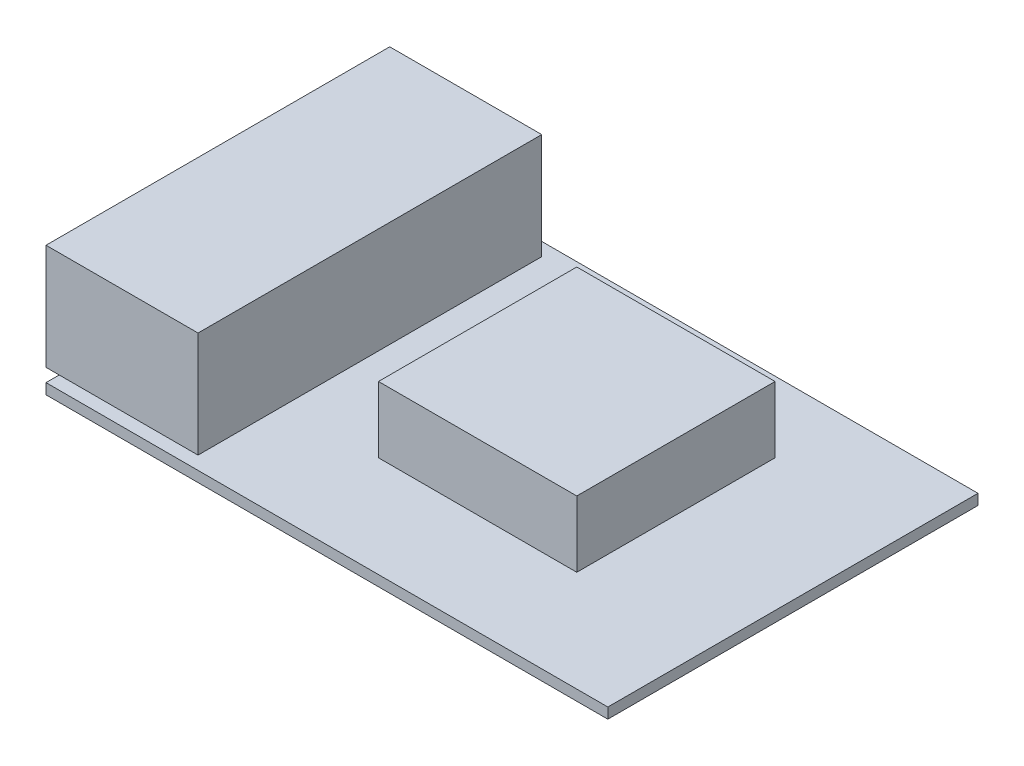
ISO-10303-21;
HEADER;
FILE_DESCRIPTION(('STEP AP214'),'2;1');
FILE_NAME('part.step','',(''),(''),'','','');
FILE_SCHEMA(('AUTOMOTIVE_DESIGN { 1 0 10303 214 1 1 1 1 }'));
ENDSEC;
DATA;
#1=APPLICATION_CONTEXT('core data for automotive mechanical design processes');
#2=APPLICATION_PROTOCOL_DEFINITION('international standard','automotive_design',2000,#1);
#3=PRODUCT_CONTEXT('',#1,'mechanical');
#4=PRODUCT('Part','Part','',(#3));
#5=PRODUCT_RELATED_PRODUCT_CATEGORY('part','',(#4));
#6=PRODUCT_DEFINITION_FORMATION('','',#4);
#7=PRODUCT_DEFINITION_CONTEXT('part definition',#1,'design');
#8=PRODUCT_DEFINITION('design','',#6,#7);
#9=PRODUCT_DEFINITION_SHAPE('','',#8);
#10=(LENGTH_UNIT() NAMED_UNIT(*) SI_UNIT(.MILLI.,.METRE.));
#11=(NAMED_UNIT(*) PLANE_ANGLE_UNIT() SI_UNIT($,.RADIAN.));
#12=(NAMED_UNIT(*) SI_UNIT($,.STERADIAN.) SOLID_ANGLE_UNIT());
#13=UNCERTAINTY_MEASURE_WITH_UNIT(LENGTH_MEASURE(1.E-05),#10,'distance_accuracy_value','');
#14=(GEOMETRIC_REPRESENTATION_CONTEXT(3) GLOBAL_UNCERTAINTY_ASSIGNED_CONTEXT((#13)) GLOBAL_UNIT_ASSIGNED_CONTEXT((#10,
#11,#12)) REPRESENTATION_CONTEXT('',''));
#15=CARTESIAN_POINT('',(0.,0.,0.));
#16=DIRECTION('',(0.,0.,1.));
#17=DIRECTION('',(1.,0.,0.));
#18=AXIS2_PLACEMENT_3D('',#15,#16,#17);
#19=CARTESIAN_POINT('',(1.,-0.400000000000001,43.));
#20=DIRECTION('',(1.,0.,0.));
#21=DIRECTION('',(0.,0.,-1.));
#22=AXIS2_PLACEMENT_3D('',#19,#20,#21);
#23=PLANE('',#22);
#24=DIRECTION('',(0.,0.,1.));
#25=VECTOR('',#24,1.);
#26=CARTESIAN_POINT('',(1.,-10.4,43.));
#27=LINE('',#26,#25);
#28=CARTESIAN_POINT('',(1.,-10.4,43.));
#29=VERTEX_POINT('',#28);
#30=CARTESIAN_POINT('',(1.,-10.4,73.));
#31=VERTEX_POINT('',#30);
#32=EDGE_CURVE('E112',#29,#31,#27,.T.);
#33=ORIENTED_EDGE('',*,*,#32,.T.);
#34=DIRECTION('',(0.,-1.,0.));
#35=VECTOR('',#34,1.);
#36=CARTESIAN_POINT('',(1.,-0.400000000000001,73.));
#37=LINE('',#36,#35);
#38=CARTESIAN_POINT('',(1.,-0.400000000000001,73.));
#39=VERTEX_POINT('',#38);
#40=EDGE_CURVE('E12',#39,#31,#37,.T.);
#41=ORIENTED_EDGE('',*,*,#40,.F.);
#42=DIRECTION('',(0.,0.,1.));
#43=VECTOR('',#42,1.);
#44=CARTESIAN_POINT('',(1.,-0.400000000000001,43.));
#45=LINE('',#44,#43);
#46=CARTESIAN_POINT('',(1.,-0.400000000000001,43.));
#47=VERTEX_POINT('',#46);
#48=EDGE_CURVE('E100',#47,#39,#45,.T.);
#49=ORIENTED_EDGE('',*,*,#48,.F.);
#50=DIRECTION('',(0.,-1.,0.));
#51=VECTOR('',#50,1.);
#52=CARTESIAN_POINT('',(1.,-0.400000000000001,43.));
#53=LINE('',#52,#51);
#54=EDGE_CURVE('E108',#47,#29,#53,.T.);
#55=ORIENTED_EDGE('',*,*,#54,.T.);
#56=EDGE_LOOP('',(#33,#41,#49,#55));
#57=FACE_BOUND('',#56,.T.);
#58=ADVANCED_FACE('F49',(#57),#23,.F.);
#59=CARTESIAN_POINT('',(1.,-0.400000000000001,73.));
#60=DIRECTION('',(0.,0.,-1.));
#61=DIRECTION('',(-1.,0.,0.));
#62=AXIS2_PLACEMENT_3D('',#59,#60,#61);
#63=PLANE('',#62);
#64=DIRECTION('',(1.,0.,0.));
#65=VECTOR('',#64,1.);
#66=CARTESIAN_POINT('',(1.,-10.4,73.));
#67=LINE('',#66,#65);
#68=CARTESIAN_POINT('',(31.,-10.4,73.));
#69=VERTEX_POINT('',#68);
#70=EDGE_CURVE('E104',#31,#69,#67,.T.);
#71=ORIENTED_EDGE('',*,*,#70,.T.);
#72=DIRECTION('',(0.,-1.,0.));
#73=VECTOR('',#72,1.);
#74=CARTESIAN_POINT('',(31.,-0.400000000000001,73.));
#75=LINE('',#74,#73);
#76=CARTESIAN_POINT('',(31.,-0.400000000000001,73.));
#77=VERTEX_POINT('',#76);
#78=EDGE_CURVE('E57',#77,#69,#75,.T.);
#79=ORIENTED_EDGE('',*,*,#78,.F.);
#80=DIRECTION('',(1.,0.,0.));
#81=VECTOR('',#80,1.);
#82=CARTESIAN_POINT('',(1.,-0.400000000000001,73.));
#83=LINE('',#82,#81);
#84=EDGE_CURVE('E95',#39,#77,#83,.T.);
#85=ORIENTED_EDGE('',*,*,#84,.F.);
#86=ORIENTED_EDGE('',*,*,#40,.T.);
#87=EDGE_LOOP('',(#71,#79,#85,#86));
#88=FACE_BOUND('',#87,.T.);
#89=ADVANCED_FACE('F103',(#88),#63,.F.);
#90=CARTESIAN_POINT('',(31.,-0.400000000000001,73.));
#91=DIRECTION('',(-1.,0.,0.));
#92=DIRECTION('',(0.,0.,1.));
#93=AXIS2_PLACEMENT_3D('',#90,#91,#92);
#94=PLANE('',#93);
#95=DIRECTION('',(0.,0.,-1.));
#96=VECTOR('',#95,1.);
#97=CARTESIAN_POINT('',(31.,-10.4,73.));
#98=LINE('',#97,#96);
#99=CARTESIAN_POINT('',(31.,-10.4,43.));
#100=VERTEX_POINT('',#99);
#101=EDGE_CURVE('E82',#69,#100,#98,.T.);
#102=ORIENTED_EDGE('',*,*,#101,.T.);
#103=DIRECTION('',(0.,-1.,0.));
#104=VECTOR('',#103,1.);
#105=CARTESIAN_POINT('',(31.,-0.400000000000001,43.));
#106=LINE('',#105,#104);
#107=CARTESIAN_POINT('',(31.,-0.400000000000001,43.));
#108=VERTEX_POINT('',#107);
#109=EDGE_CURVE('E105',#108,#100,#106,.T.);
#110=ORIENTED_EDGE('',*,*,#109,.F.);
#111=DIRECTION('',(0.,0.,-1.));
#112=VECTOR('',#111,1.);
#113=CARTESIAN_POINT('',(31.,-0.400000000000001,73.));
#114=LINE('',#113,#112);
#115=EDGE_CURVE('E98',#77,#108,#114,.T.);
#116=ORIENTED_EDGE('',*,*,#115,.F.);
#117=ORIENTED_EDGE('',*,*,#78,.T.);
#118=EDGE_LOOP('',(#102,#110,#116,#117));
#119=FACE_BOUND('',#118,.T.);
#120=ADVANCED_FACE('F106',(#119),#94,.F.);
#121=CARTESIAN_POINT('',(31.,-0.400000000000001,43.));
#122=DIRECTION('',(0.,0.,1.));
#123=DIRECTION('',(1.,0.,0.));
#124=AXIS2_PLACEMENT_3D('',#121,#122,#123);
#125=PLANE('',#124);
#126=DIRECTION('',(-1.,0.,0.));
#127=VECTOR('',#126,1.);
#128=CARTESIAN_POINT('',(31.,-10.4,43.));
#129=LINE('',#128,#127);
#130=EDGE_CURVE('E88',#100,#29,#129,.T.);
#131=ORIENTED_EDGE('',*,*,#130,.T.);
#132=ORIENTED_EDGE('',*,*,#54,.F.);
#133=DIRECTION('',(-1.,0.,0.));
#134=VECTOR('',#133,1.);
#135=CARTESIAN_POINT('',(31.,-0.400000000000001,43.));
#136=LINE('',#135,#134);
#137=EDGE_CURVE('E65',#108,#47,#136,.T.);
#138=ORIENTED_EDGE('',*,*,#137,.F.);
#139=ORIENTED_EDGE('',*,*,#109,.T.);
#140=EDGE_LOOP('',(#131,#132,#138,#139));
#141=FACE_BOUND('',#140,.T.);
#142=ADVANCED_FACE('F119',(#141),#125,.F.);
#143=CARTESIAN_POINT('',(0.,-0.400000000000001,0.));
#144=DIRECTION('',(0.,1.,0.));
#145=DIRECTION('',(0.,0.,1.));
#146=AXIS2_PLACEMENT_3D('',#143,#144,#145);
#147=PLANE('',#146);
#148=ORIENTED_EDGE('',*,*,#48,.T.);
#149=ORIENTED_EDGE('',*,*,#84,.T.);
#150=ORIENTED_EDGE('',*,*,#115,.T.);
#151=ORIENTED_EDGE('',*,*,#137,.T.);
#152=EDGE_LOOP('',(#148,#149,#150,#151));
#153=FACE_BOUND('',#152,.T.);
#154=ADVANCED_FACE('F96',(#153),#147,.T.);
#155=CARTESIAN_POINT('',(0.,-10.4,0.));
#156=DIRECTION('',(0.,1.,0.));
#157=DIRECTION('',(0.,0.,1.));
#158=AXIS2_PLACEMENT_3D('',#155,#156,#157);
#159=PLANE('',#158);
#160=ORIENTED_EDGE('',*,*,#32,.F.);
#161=ORIENTED_EDGE('',*,*,#130,.F.);
#162=ORIENTED_EDGE('',*,*,#101,.F.);
#163=ORIENTED_EDGE('',*,*,#70,.F.);
#164=EDGE_LOOP('',(#160,#161,#162,#163));
#165=FACE_BOUND('',#164,.T.);
#166=ADVANCED_FACE('F122',(#165),#159,.F.);
#167=CLOSED_SHELL('',(#58,#89,#120,#142,#154,#166));
#168=MANIFOLD_SOLID_BREP('B2',#167);
#169=CARTESIAN_POINT('',(-40.,-16.4,26.3));
#170=DIRECTION('',(1.,0.,0.));
#171=DIRECTION('',(0.,0.,-1.));
#172=AXIS2_PLACEMENT_3D('',#169,#170,#171);
#173=PLANE('',#172);
#174=DIRECTION('',(0.,0.,1.));
#175=VECTOR('',#174,1.);
#176=CARTESIAN_POINT('',(-40.,-18.,26.3));
#177=LINE('',#176,#175);
#178=CARTESIAN_POINT('',(-40.,-18.,26.3));
#179=VERTEX_POINT('',#178);
#180=CARTESIAN_POINT('',(-40.,-18.,82.3));
#181=VERTEX_POINT('',#180);
#182=EDGE_CURVE('E268',#179,#181,#177,.T.);
#183=ORIENTED_EDGE('',*,*,#182,.T.);
#184=DIRECTION('',(0.,-1.,0.));
#185=VECTOR('',#184,1.);
#186=CARTESIAN_POINT('',(-40.,-16.4,82.3));
#187=LINE('',#186,#185);
#188=CARTESIAN_POINT('',(-40.,-16.4,82.3));
#189=VERTEX_POINT('',#188);
#190=EDGE_CURVE('E176',#189,#181,#187,.T.);
#191=ORIENTED_EDGE('',*,*,#190,.F.);
#192=DIRECTION('',(0.,0.,1.));
#193=VECTOR('',#192,1.);
#194=CARTESIAN_POINT('',(-40.,-16.4,26.3));
#195=LINE('',#194,#193);
#196=CARTESIAN_POINT('',(-40.,-16.4,80.3));
#197=VERTEX_POINT('',#196);
#198=EDGE_CURVE('E281',#197,#189,#195,.T.);
#199=ORIENTED_EDGE('',*,*,#198,.F.);
#200=CARTESIAN_POINT('',(-40.,-16.4,28.3));
#201=VERTEX_POINT('',#200);
#202=EDGE_CURVE('E280',#201,#197,#195,.T.);
#203=ORIENTED_EDGE('',*,*,#202,.F.);
#204=CARTESIAN_POINT('',(-40.,-16.4,26.3));
#205=VERTEX_POINT('',#204);
#206=EDGE_CURVE('E277',#205,#201,#195,.T.);
#207=ORIENTED_EDGE('',*,*,#206,.F.);
#208=DIRECTION('',(0.,-1.,0.));
#209=VECTOR('',#208,1.);
#210=CARTESIAN_POINT('',(-40.,-16.4,26.3));
#211=LINE('',#210,#209);
#212=EDGE_CURVE('E286',#205,#179,#211,.T.);
#213=ORIENTED_EDGE('',*,*,#212,.T.);
#214=EDGE_LOOP('',(#183,#191,#199,#203,#207,#213));
#215=FACE_BOUND('',#214,.T.);
#216=ADVANCED_FACE('F173',(#215),#173,.F.);
#217=CARTESIAN_POINT('',(-40.,-16.4,82.3));
#218=DIRECTION('',(0.,0.,-1.));
#219=DIRECTION('',(-1.,0.,0.));
#220=AXIS2_PLACEMENT_3D('',#217,#218,#219);
#221=PLANE('',#220);
#222=DIRECTION('',(1.,0.,0.));
#223=VECTOR('',#222,1.);
#224=CARTESIAN_POINT('',(-40.,-18.,82.3));
#225=LINE('',#224,#223);
#226=CARTESIAN_POINT('',(45.,-18.,82.3));
#227=VERTEX_POINT('',#226);
#228=EDGE_CURVE('E271',#181,#227,#225,.T.);
#229=ORIENTED_EDGE('',*,*,#228,.T.);
#230=DIRECTION('',(0.,-1.,0.));
#231=VECTOR('',#230,1.);
#232=CARTESIAN_POINT('',(45.,-16.4,82.3));
#233=LINE('',#232,#231);
#234=CARTESIAN_POINT('',(45.,-16.4,82.3));
#235=VERTEX_POINT('',#234);
#236=EDGE_CURVE('E297',#235,#227,#233,.T.);
#237=ORIENTED_EDGE('',*,*,#236,.F.);
#238=DIRECTION('',(1.,0.,0.));
#239=VECTOR('',#238,1.);
#240=CARTESIAN_POINT('',(-40.,-16.4,82.3));
#241=LINE('',#240,#239);
#242=EDGE_CURVE('E279',#189,#235,#241,.T.);
#243=ORIENTED_EDGE('',*,*,#242,.F.);
#244=ORIENTED_EDGE('',*,*,#190,.T.);
#245=EDGE_LOOP('',(#229,#237,#243,#244));
#246=FACE_BOUND('',#245,.T.);
#247=ADVANCED_FACE('F307',(#246),#221,.F.);
#248=CARTESIAN_POINT('',(45.,-16.4,82.3));
#249=DIRECTION('',(-1.,0.,0.));
#250=DIRECTION('',(0.,0.,1.));
#251=AXIS2_PLACEMENT_3D('',#248,#249,#250);
#252=PLANE('',#251);
#253=DIRECTION('',(0.,0.,-1.));
#254=VECTOR('',#253,1.);
#255=CARTESIAN_POINT('',(45.,-18.,82.3));
#256=LINE('',#255,#254);
#257=CARTESIAN_POINT('',(45.,-18.,26.3));
#258=VERTEX_POINT('',#257);
#259=EDGE_CURVE('E289',#227,#258,#256,.T.);
#260=ORIENTED_EDGE('',*,*,#259,.T.);
#261=DIRECTION('',(0.,-1.,0.));
#262=VECTOR('',#261,1.);
#263=CARTESIAN_POINT('',(45.,-16.4,26.3));
#264=LINE('',#263,#262);
#265=CARTESIAN_POINT('',(45.,-16.4,26.3));
#266=VERTEX_POINT('',#265);
#267=EDGE_CURVE('E295',#266,#258,#264,.T.);
#268=ORIENTED_EDGE('',*,*,#267,.F.);
#269=DIRECTION('',(0.,0.,-1.));
#270=VECTOR('',#269,1.);
#271=CARTESIAN_POINT('',(45.,-16.4,82.3));
#272=LINE('',#271,#270);
#273=EDGE_CURVE('E283',#235,#266,#272,.T.);
#274=ORIENTED_EDGE('',*,*,#273,.F.);
#275=ORIENTED_EDGE('',*,*,#236,.T.);
#276=EDGE_LOOP('',(#260,#268,#274,#275));
#277=FACE_BOUND('',#276,.T.);
#278=ADVANCED_FACE('F316',(#277),#252,.F.);
#279=CARTESIAN_POINT('',(45.,-16.4,26.3));
#280=DIRECTION('',(0.,0.,1.));
#281=DIRECTION('',(1.,0.,0.));
#282=AXIS2_PLACEMENT_3D('',#279,#280,#281);
#283=PLANE('',#282);
#284=DIRECTION('',(-1.,0.,0.));
#285=VECTOR('',#284,1.);
#286=CARTESIAN_POINT('',(45.,-18.,26.3));
#287=LINE('',#286,#285);
#288=EDGE_CURVE('E291',#258,#179,#287,.T.);
#289=ORIENTED_EDGE('',*,*,#288,.T.);
#290=ORIENTED_EDGE('',*,*,#212,.F.);
#291=DIRECTION('',(-1.,0.,0.));
#292=VECTOR('',#291,1.);
#293=CARTESIAN_POINT('',(45.,-16.4,26.3));
#294=LINE('',#293,#292);
#295=EDGE_CURVE('E285',#266,#205,#294,.T.);
#296=ORIENTED_EDGE('',*,*,#295,.F.);
#297=ORIENTED_EDGE('',*,*,#267,.T.);
#298=EDGE_LOOP('',(#289,#290,#296,#297));
#299=FACE_BOUND('',#298,.T.);
#300=ADVANCED_FACE('F319',(#299),#283,.F.);
#301=CARTESIAN_POINT('',(0.,-16.4,0.));
#302=DIRECTION('',(0.,1.,0.));
#303=DIRECTION('',(0.,0.,1.));
#304=AXIS2_PLACEMENT_3D('',#301,#302,#303);
#305=PLANE('',#304);
#306=DIRECTION('',(-1.,0.,0.));
#307=VECTOR('',#306,1.);
#308=CARTESIAN_POINT('',(-19.,-16.4,28.3));
#309=LINE('',#308,#307);
#310=CARTESIAN_POINT('',(-19.,-16.4,28.3));
#311=VERTEX_POINT('',#310);
#312=EDGE_CURVE('E189',#311,#201,#309,.T.);
#313=ORIENTED_EDGE('',*,*,#312,.F.);
#314=DIRECTION('',(0.,0.,-1.));
#315=VECTOR('',#314,1.);
#316=CARTESIAN_POINT('',(-19.,-16.4,80.3));
#317=LINE('',#316,#315);
#318=CARTESIAN_POINT('',(-19.,-16.4,80.3));
#319=VERTEX_POINT('',#318);
#320=EDGE_CURVE('E326',#319,#311,#317,.T.);
#321=ORIENTED_EDGE('',*,*,#320,.F.);
#322=DIRECTION('',(1.,0.,0.));
#323=VECTOR('',#322,1.);
#324=CARTESIAN_POINT('',(-42.,-16.4,80.3));
#325=LINE('',#324,#323);
#326=EDGE_CURVE('E47',#197,#319,#325,.T.);
#327=ORIENTED_EDGE('',*,*,#326,.F.);
#328=ORIENTED_EDGE('',*,*,#198,.T.);
#329=ORIENTED_EDGE('',*,*,#242,.T.);
#330=ORIENTED_EDGE('',*,*,#273,.T.);
#331=ORIENTED_EDGE('',*,*,#295,.T.);
#332=ORIENTED_EDGE('',*,*,#206,.T.);
#333=EDGE_LOOP('',(#313,#321,#327,#328,#329,#330,#331,#332));
#334=FACE_BOUND('',#333,.T.);
#335=ADVANCED_FACE('F320',(#334),#305,.T.);
#336=CARTESIAN_POINT('',(0.,-18.,0.));
#337=DIRECTION('',(0.,1.,0.));
#338=DIRECTION('',(0.,0.,1.));
#339=AXIS2_PLACEMENT_3D('',#336,#337,#338);
#340=PLANE('',#339);
#341=ORIENTED_EDGE('',*,*,#182,.F.);
#342=ORIENTED_EDGE('',*,*,#288,.F.);
#343=ORIENTED_EDGE('',*,*,#259,.F.);
#344=ORIENTED_EDGE('',*,*,#228,.F.);
#345=EDGE_LOOP('',(#341,#342,#343,#344));
#346=FACE_BOUND('',#345,.T.);
#347=ADVANCED_FACE('F314',(#346),#340,.F.);
#348=CARTESIAN_POINT('',(0.,-16.4,0.));
#349=DIRECTION('',(0.,1.,0.));
#350=DIRECTION('',(0.,0.,1.));
#351=AXIS2_PLACEMENT_3D('',#348,#349,#350);
#352=PLANE('',#351);
#353=CARTESIAN_POINT('',(-42.,-16.4,28.3));
#354=VERTEX_POINT('',#353);
#355=EDGE_CURVE('E325',#201,#354,#309,.T.);
#356=ORIENTED_EDGE('',*,*,#355,.F.);
#357=ORIENTED_EDGE('',*,*,#202,.T.);
#358=CARTESIAN_POINT('',(-42.,-16.4,80.3));
#359=VERTEX_POINT('',#358);
#360=EDGE_CURVE('E182',#359,#197,#325,.T.);
#361=ORIENTED_EDGE('',*,*,#360,.F.);
#362=DIRECTION('',(0.,0.,1.));
#363=VECTOR('',#362,1.);
#364=CARTESIAN_POINT('',(-42.,-16.4,28.3));
#365=LINE('',#364,#363);
#366=EDGE_CURVE('E267',#354,#359,#365,.T.);
#367=ORIENTED_EDGE('',*,*,#366,.F.);
#368=EDGE_LOOP('',(#356,#357,#361,#367));
#369=FACE_BOUND('',#368,.T.);
#370=ADVANCED_FACE('F324',(#369),#352,.F.);
#371=CARTESIAN_POINT('',(-42.,-0.399999999999998,28.3));
#372=DIRECTION('',(1.,0.,0.));
#373=DIRECTION('',(0.,0.,-1.));
#374=AXIS2_PLACEMENT_3D('',#371,#372,#373);
#375=PLANE('',#374);
#376=ORIENTED_EDGE('',*,*,#366,.T.);
#377=DIRECTION('',(0.,-1.,0.));
#378=VECTOR('',#377,1.);
#379=CARTESIAN_POINT('',(-42.,-0.399999999999998,80.3));
#380=LINE('',#379,#378);
#381=CARTESIAN_POINT('',(-42.,-0.399999999999998,80.3));
#382=VERTEX_POINT('',#381);
#383=EDGE_CURVE('E248',#382,#359,#380,.T.);
#384=ORIENTED_EDGE('',*,*,#383,.F.);
#385=DIRECTION('',(0.,0.,1.));
#386=VECTOR('',#385,1.);
#387=CARTESIAN_POINT('',(-42.,-0.399999999999998,28.3));
#388=LINE('',#387,#386);
#389=CARTESIAN_POINT('',(-42.,-0.399999999999998,28.3));
#390=VERTEX_POINT('',#389);
#391=EDGE_CURVE('E255',#390,#382,#388,.T.);
#392=ORIENTED_EDGE('',*,*,#391,.F.);
#393=DIRECTION('',(0.,-1.,0.));
#394=VECTOR('',#393,1.);
#395=CARTESIAN_POINT('',(-42.,-0.399999999999998,28.3));
#396=LINE('',#395,#394);
#397=EDGE_CURVE('E332',#390,#354,#396,.T.);
#398=ORIENTED_EDGE('',*,*,#397,.T.);
#399=EDGE_LOOP('',(#376,#384,#392,#398));
#400=FACE_BOUND('',#399,.T.);
#401=ADVANCED_FACE('F265',(#400),#375,.F.);
#402=CARTESIAN_POINT('',(-42.,-0.399999999999998,80.3));
#403=DIRECTION('',(0.,0.,-1.));
#404=DIRECTION('',(-1.,0.,0.));
#405=AXIS2_PLACEMENT_3D('',#402,#403,#404);
#406=PLANE('',#405);
#407=ORIENTED_EDGE('',*,*,#360,.T.);
#408=ORIENTED_EDGE('',*,*,#326,.T.);
#409=DIRECTION('',(0.,-1.,0.));
#410=VECTOR('',#409,1.);
#411=CARTESIAN_POINT('',(-19.,-0.399999999999998,80.3));
#412=LINE('',#411,#410);
#413=CARTESIAN_POINT('',(-19.,-0.399999999999998,80.3));
#414=VERTEX_POINT('',#413);
#415=EDGE_CURVE('E251',#414,#319,#412,.T.);
#416=ORIENTED_EDGE('',*,*,#415,.F.);
#417=DIRECTION('',(1.,0.,0.));
#418=VECTOR('',#417,1.);
#419=CARTESIAN_POINT('',(-42.,-0.399999999999998,80.3));
#420=LINE('',#419,#418);
#421=EDGE_CURVE('E243',#382,#414,#420,.T.);
#422=ORIENTED_EDGE('',*,*,#421,.F.);
#423=ORIENTED_EDGE('',*,*,#383,.T.);
#424=EDGE_LOOP('',(#407,#408,#416,#422,#423));
#425=FACE_BOUND('',#424,.T.);
#426=ADVANCED_FACE('F246',(#425),#406,.F.);
#427=CARTESIAN_POINT('',(-19.,-0.399999999999998,80.3));
#428=DIRECTION('',(-1.,0.,0.));
#429=DIRECTION('',(0.,0.,1.));
#430=AXIS2_PLACEMENT_3D('',#427,#428,#429);
#431=PLANE('',#430);
#432=ORIENTED_EDGE('',*,*,#320,.T.);
#433=DIRECTION('',(0.,-1.,0.));
#434=VECTOR('',#433,1.);
#435=CARTESIAN_POINT('',(-19.,-0.399999999999998,28.3));
#436=LINE('',#435,#434);
#437=CARTESIAN_POINT('',(-19.,-0.399999999999998,28.3));
#438=VERTEX_POINT('',#437);
#439=EDGE_CURVE('E273',#438,#311,#436,.T.);
#440=ORIENTED_EDGE('',*,*,#439,.F.);
#441=DIRECTION('',(0.,0.,-1.));
#442=VECTOR('',#441,1.);
#443=CARTESIAN_POINT('',(-19.,-0.399999999999998,80.3));
#444=LINE('',#443,#442);
#445=EDGE_CURVE('E254',#414,#438,#444,.T.);
#446=ORIENTED_EDGE('',*,*,#445,.F.);
#447=ORIENTED_EDGE('',*,*,#415,.T.);
#448=EDGE_LOOP('',(#432,#440,#446,#447));
#449=FACE_BOUND('',#448,.T.);
#450=ADVANCED_FACE('F338',(#449),#431,.F.);
#451=CARTESIAN_POINT('',(-19.,-0.399999999999998,28.3));
#452=DIRECTION('',(0.,0.,1.));
#453=DIRECTION('',(1.,0.,0.));
#454=AXIS2_PLACEMENT_3D('',#451,#452,#453);
#455=PLANE('',#454);
#456=ORIENTED_EDGE('',*,*,#312,.T.);
#457=ORIENTED_EDGE('',*,*,#355,.T.);
#458=ORIENTED_EDGE('',*,*,#397,.F.);
#459=DIRECTION('',(-1.,0.,0.));
#460=VECTOR('',#459,1.);
#461=CARTESIAN_POINT('',(-19.,-0.399999999999998,28.3));
#462=LINE('',#461,#460);
#463=EDGE_CURVE('E260',#438,#390,#462,.T.);
#464=ORIENTED_EDGE('',*,*,#463,.F.);
#465=ORIENTED_EDGE('',*,*,#439,.T.);
#466=EDGE_LOOP('',(#456,#457,#458,#464,#465));
#467=FACE_BOUND('',#466,.T.);
#468=ADVANCED_FACE('F336',(#467),#455,.F.);
#469=CARTESIAN_POINT('',(0.,-0.399999999999998,0.));
#470=DIRECTION('',(0.,1.,0.));
#471=DIRECTION('',(0.,0.,1.));
#472=AXIS2_PLACEMENT_3D('',#469,#470,#471);
#473=PLANE('',#472);
#474=ORIENTED_EDGE('',*,*,#391,.T.);
#475=ORIENTED_EDGE('',*,*,#421,.T.);
#476=ORIENTED_EDGE('',*,*,#445,.T.);
#477=ORIENTED_EDGE('',*,*,#463,.T.);
#478=EDGE_LOOP('',(#474,#475,#476,#477));
#479=FACE_BOUND('',#478,.T.);
#480=ADVANCED_FACE('F258',(#479),#473,.T.);
#481=CLOSED_SHELL('',(#216,#247,#278,#300,#335,#347,#370,#401,#426,#450,#468,#480));
#482=MANIFOLD_SOLID_BREP('B6',#481);
#483=ADVANCED_BREP_SHAPE_REPRESENTATION('',(#18,#168,#482),#14);
#484=SHAPE_DEFINITION_REPRESENTATION(#9,#483);
ENDSEC;
END-ISO-10303-21;
